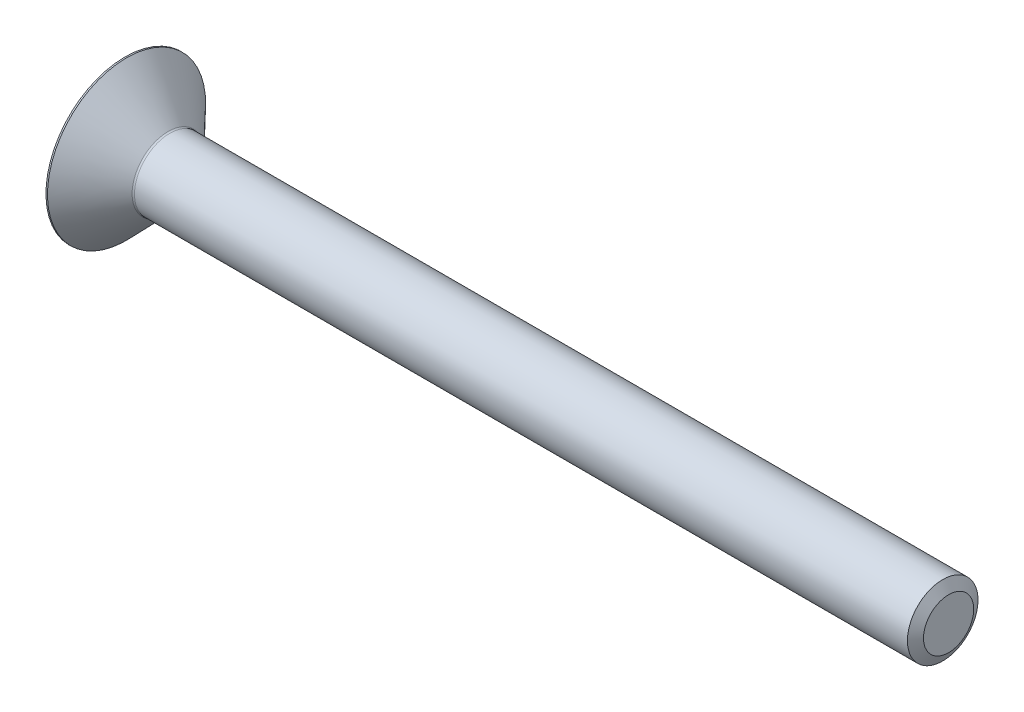
ISO-10303-21;
HEADER;
FILE_DESCRIPTION(('STEP AP214'),'2;1');
FILE_NAME('part.step','',(''),(''),'','','');
FILE_SCHEMA(('AUTOMOTIVE_DESIGN { 1 0 10303 214 1 1 1 1 }'));
ENDSEC;
DATA;
#1=APPLICATION_CONTEXT('core data for automotive mechanical design processes');
#2=APPLICATION_PROTOCOL_DEFINITION('international standard','automotive_design',2000,#1);
#3=PRODUCT_CONTEXT('',#1,'mechanical');
#4=PRODUCT('Part','Part','',(#3));
#5=PRODUCT_RELATED_PRODUCT_CATEGORY('part','',(#4));
#6=PRODUCT_DEFINITION_FORMATION('','',#4);
#7=PRODUCT_DEFINITION_CONTEXT('part definition',#1,'design');
#8=PRODUCT_DEFINITION('design','',#6,#7);
#9=PRODUCT_DEFINITION_SHAPE('','',#8);
#10=(LENGTH_UNIT() NAMED_UNIT(*) SI_UNIT(.MILLI.,.METRE.));
#11=(NAMED_UNIT(*) PLANE_ANGLE_UNIT() SI_UNIT($,.RADIAN.));
#12=(NAMED_UNIT(*) SI_UNIT($,.STERADIAN.) SOLID_ANGLE_UNIT());
#13=UNCERTAINTY_MEASURE_WITH_UNIT(LENGTH_MEASURE(1.E-05),#10,'distance_accuracy_value','');
#14=(GEOMETRIC_REPRESENTATION_CONTEXT(3) GLOBAL_UNCERTAINTY_ASSIGNED_CONTEXT((#13)) GLOBAL_UNIT_ASSIGNED_CONTEXT((#10,
#11,#12)) REPRESENTATION_CONTEXT('',''));
#15=CARTESIAN_POINT('',(0.,0.,0.));
#16=DIRECTION('',(0.,0.,1.));
#17=DIRECTION('',(1.,0.,0.));
#18=AXIS2_PLACEMENT_3D('',#15,#16,#17);
#19=CARTESIAN_POINT('',(0.,0.,0.));
#20=DIRECTION('',(1.,0.,0.));
#21=DIRECTION('',(0.,1.,0.));
#22=AXIS2_PLACEMENT_3D('',#19,#20,#21);
#23=CYLINDRICAL_SURFACE('',#22,1.5);
#24=CARTESIAN_POINT('',(-33.0975525183791,0.,0.));
#25=DIRECTION('',(1.,0.,0.));
#26=DIRECTION('',(0.,1.,0.));
#27=AXIS2_PLACEMENT_3D('',#24,#25,#26);
#28=CIRCLE('',#27,1.5);
#29=CARTESIAN_POINT('',(-33.0975525183791,1.5,0.));
#30=VERTEX_POINT('',#29);
#31=EDGE_CURVE('E102',#30,#30,#28,.T.);
#32=ORIENTED_EDGE('',*,*,#31,.T.);
#33=EDGE_LOOP('',(#32));
#34=FACE_BOUND('',#33,.T.);
#35=CARTESIAN_POINT('',(-0.25,0.,0.));
#36=DIRECTION('',(-1.,0.,0.));
#37=DIRECTION('',(0.,0.,1.));
#38=AXIS2_PLACEMENT_3D('',#35,#36,#37);
#39=CIRCLE('',#38,1.5);
#40=CARTESIAN_POINT('',(-0.25,0.,1.5));
#41=VERTEX_POINT('',#40);
#42=EDGE_CURVE('E92',#41,#41,#39,.T.);
#43=ORIENTED_EDGE('',*,*,#42,.T.);
#44=EDGE_LOOP('',(#43));
#45=FACE_BOUND('',#44,.T.);
#46=ADVANCED_FACE('F17',(#34,#45),#23,.T.);
#47=CARTESIAN_POINT('',(-35.,3.36,0.));
#48=DIRECTION('',(-1.,0.,0.));
#49=DIRECTION('',(0.,-1.,0.));
#50=AXIS2_PLACEMENT_3D('',#47,#48,#49);
#51=PLANE('',#50);
#52=CARTESIAN_POINT('',(-35.,0.,0.));
#53=DIRECTION('',(1.,0.,0.));
#54=DIRECTION('',(0.,1.,0.));
#55=AXIS2_PLACEMENT_3D('',#52,#53,#54);
#56=CIRCLE('',#55,3.36);
#57=CARTESIAN_POINT('',(-35.,3.36,0.));
#58=VERTEX_POINT('',#57);
#59=EDGE_CURVE('E198',#58,#58,#56,.T.);
#60=ORIENTED_EDGE('',*,*,#59,.F.);
#61=EDGE_LOOP('',(#60));
#62=FACE_BOUND('',#61,.T.);
#63=CARTESIAN_POINT('',(-35.,0.,0.));
#64=DIRECTION('',(-1.,0.,0.));
#65=DIRECTION('',(0.,-1.,0.));
#66=AXIS2_PLACEMENT_3D('',#63,#64,#65);
#67=CIRCLE('',#66,1.15470053837925);
#68=CARTESIAN_POINT('',(-35.,-0.577350269189638,0.999999999999989));
#69=VERTEX_POINT('',#68);
#70=CARTESIAN_POINT('',(-35.,-1.15470053837925,0.));
#71=VERTEX_POINT('',#70);
#72=EDGE_CURVE('E21',#69,#71,#67,.F.);
#73=ORIENTED_EDGE('',*,*,#72,.T.);
#74=CARTESIAN_POINT('',(-35.,-0.577350269189637,-0.999999999999989));
#75=VERTEX_POINT('',#74);
#76=EDGE_CURVE('E11',#71,#75,#67,.F.);
#77=ORIENTED_EDGE('',*,*,#76,.T.);
#78=CARTESIAN_POINT('',(-35.,0.577350269189622,-1.));
#79=VERTEX_POINT('',#78);
#80=EDGE_CURVE('E27',#75,#79,#67,.F.);
#81=ORIENTED_EDGE('',*,*,#80,.T.);
#82=CARTESIAN_POINT('',(-35.,1.15470053837925,0.));
#83=VERTEX_POINT('',#82);
#84=EDGE_CURVE('E93',#79,#83,#67,.F.);
#85=ORIENTED_EDGE('',*,*,#84,.T.);
#86=CARTESIAN_POINT('',(-35.,0.,0.));
#87=DIRECTION('',(-1.,0.,0.));
#88=DIRECTION('',(0.,0.,1.));
#89=AXIS2_PLACEMENT_3D('',#86,#87,#88);
#90=CIRCLE('',#89,1.15470053837925);
#91=CARTESIAN_POINT('',(-35.,0.577350269189626,1.));
#92=VERTEX_POINT('',#91);
#93=EDGE_CURVE('E76',#92,#83,#90,.T.);
#94=ORIENTED_EDGE('',*,*,#93,.F.);
#95=EDGE_CURVE('E83',#92,#69,#67,.F.);
#96=ORIENTED_EDGE('',*,*,#95,.T.);
#97=EDGE_LOOP('',(#73,#77,#81,#85,#94,#96));
#98=FACE_BOUND('',#97,.T.);
#99=ADVANCED_FACE('F95',(#62,#98),#51,.T.);
#100=CARTESIAN_POINT('',(0.,0.,0.));
#101=DIRECTION('',(1.,0.,0.));
#102=DIRECTION('',(0.,1.,0.));
#103=AXIS2_PLACEMENT_3D('',#100,#101,#102);
#104=CYLINDRICAL_SURFACE('',#103,3.36);
#105=ORIENTED_EDGE('',*,*,#59,.T.);
#106=EDGE_LOOP('',(#105));
#107=FACE_BOUND('',#106,.T.);
#108=CARTESIAN_POINT('',(-34.9361811211411,0.,0.));
#109=DIRECTION('',(1.,0.,0.));
#110=DIRECTION('',(0.,1.,0.));
#111=AXIS2_PLACEMENT_3D('',#108,#109,#110);
#112=CIRCLE('',#111,3.36);
#113=CARTESIAN_POINT('',(-34.9361811211411,3.36,0.));
#114=VERTEX_POINT('',#113);
#115=EDGE_CURVE('E196',#114,#114,#112,.T.);
#116=ORIENTED_EDGE('',*,*,#115,.F.);
#117=EDGE_LOOP('',(#116));
#118=FACE_BOUND('',#117,.T.);
#119=ADVANCED_FACE('F183',(#107,#118),#104,.T.);
#120=CARTESIAN_POINT('',(-33.1694864984129,0.,0.));
#121=DIRECTION('',(-1.,0.,0.));
#122=DIRECTION('',(0.,-1.,0.));
#123=AXIS2_PLACEMENT_3D('',#120,#121,#122);
#124=CONICAL_SURFACE('',#123,1.5305341629541,0.802851455917395);
#125=ORIENTED_EDGE('',*,*,#115,.T.);
#126=EDGE_LOOP('',(#125));
#127=FACE_BOUND('',#126,.T.);
#128=CARTESIAN_POINT('',(-33.1694864984129,0.,0.));
#129=DIRECTION('',(1.,0.,0.));
#130=DIRECTION('',(0.,1.,0.));
#131=AXIS2_PLACEMENT_3D('',#128,#129,#130);
#132=CIRCLE('',#131,1.5305341629541);
#133=CARTESIAN_POINT('',(-33.1694864984129,1.5305341629541,0.));
#134=VERTEX_POINT('',#133);
#135=EDGE_CURVE('E205',#134,#134,#132,.T.);
#136=ORIENTED_EDGE('',*,*,#135,.F.);
#137=EDGE_LOOP('',(#136));
#138=FACE_BOUND('',#137,.T.);
#139=ADVANCED_FACE('F177',(#127,#138),#124,.T.);
#140=CARTESIAN_POINT('',(-33.0975525183791,0.,0.));
#141=DIRECTION('',(1.,0.,0.));
#142=DIRECTION('',(0.,1.,0.));
#143=AXIS2_PLACEMENT_3D('',#140,#141,#142);
#144=TOROIDAL_SURFACE('',#143,1.6,0.0999999999999989);
#145=ORIENTED_EDGE('',*,*,#135,.T.);
#146=EDGE_LOOP('',(#145));
#147=FACE_BOUND('',#146,.T.);
#148=ORIENTED_EDGE('',*,*,#31,.F.);
#149=EDGE_LOOP('',(#148));
#150=FACE_BOUND('',#149,.T.);
#151=ADVANCED_FACE('F175',(#147,#150),#144,.F.);
#152=CARTESIAN_POINT('',(-34.67,0.,0.));
#153=DIRECTION('',(-1.,0.,0.));
#154=DIRECTION('',(0.,0.,1.));
#155=AXIS2_PLACEMENT_3D('',#152,#153,#154);
#156=CONICAL_SURFACE('',#155,0.,1.2924281638629);
#157=CARTESIAN_POINT('',(-35.0000330049495,-0.577234799135792,1.0002));
#158=CARTESIAN_POINT('',(-34.9931767723132,-0.601209328784407,0.958674896561033));
#159=CARTESIAN_POINT('',(-34.986950249306,-0.62523320973396,0.917064314161422));
#160=CARTESIAN_POINT('',(-34.9760082019855,-0.673377505205151,0.833675948310711));
#161=CARTESIAN_POINT('',(-34.9712933817242,-0.697497959424802,0.791898096100637));
#162=CARTESIAN_POINT('',(-34.9636556441477,-0.745669161891499,0.70846312596663));
#163=CARTESIAN_POINT('',(-34.9607223745609,-0.769719488656237,0.666806738071471));
#164=CARTESIAN_POINT('',(-34.9567889588686,-0.817855017501821,0.583433556461721));
#165=CARTESIAN_POINT('',(-34.9557883832489,-0.841940210643132,0.541716778230861));
#166=CARTESIAN_POINT('',(-34.9557883832489,-0.890110596925755,0.45828322176914));
#167=CARTESIAN_POINT('',(-34.9567889588686,-0.914195790067066,0.41656644353828));
#168=CARTESIAN_POINT('',(-34.9607223745609,-0.96233131891265,0.33319326192853));
#169=CARTESIAN_POINT('',(-34.9636556441477,-0.986381645677388,0.29153687403337));
#170=CARTESIAN_POINT('',(-34.9712933817242,-1.03455284814408,0.208101903899364));
#171=CARTESIAN_POINT('',(-34.9760082019855,-1.05867330236374,0.16632405168929));
#172=CARTESIAN_POINT('',(-34.986950249306,-1.10681759783493,0.0829356858385795));
#173=CARTESIAN_POINT('',(-34.9931767723132,-1.13084147878448,0.0413251034389682));
#174=CARTESIAN_POINT('',(-35.0000330049495,-1.15481600843309,-0.000199999999999413));
#175=B_SPLINE_CURVE_WITH_KNOTS('',3,(#157,#158,#159,#160,#161,#162,#163,#164,#165,#166,#167,
#168,#169,#170,#171,#172,#173,#174),.UNSPECIFIED.,.F.,.F.,(4,2,2,2,2,2,2,2,4),(0.,
0.145319064827825,0.290705711767534,0.435239252261502,0.579740668498363,0.724242084735224,
0.868775625229192,1.0141622721689,1.15948133699673),.UNSPECIFIED.);
#176=EDGE_CURVE('E109',#69,#71,#175,.T.);
#177=ORIENTED_EDGE('',*,*,#176,.T.);
#178=ORIENTED_EDGE('',*,*,#72,.F.);
#179=EDGE_LOOP('',(#177,#178));
#180=FACE_BOUND('',#179,.T.);
#181=ADVANCED_FACE('F178',(#180),#156,.F.);
#182=CARTESIAN_POINT('',(-35.1864201247989,-1.50507658562173,1.));
#183=CARTESIAN_POINT('',(-35.1756805338984,-1.4599519168315,1.));
#184=CARTESIAN_POINT('',(-35.1650772555009,-1.41479478404146,1.));
#185=CARTESIAN_POINT('',(-35.1442124650908,-1.32439927872502,1.));
#186=CARTESIAN_POINT('',(-35.1339509706694,-1.27916090214298,1.));
#187=CARTESIAN_POINT('',(-35.1037611048582,-1.14320091952672,1.));
#188=CARTESIAN_POINT('',(-35.0844526928259,-1.0523395057026,1.));
#189=CARTESIAN_POINT('',(-35.0485427680109,-0.871021733651421,1.));
#190=CARTESIAN_POINT('',(-35.0319160072656,-0.780570478060278,1.));
#191=CARTESIAN_POINT('',(-35.0024593897724,-0.59905383403234,1.));
#192=CARTESIAN_POINT('',(-34.9896286440471,-0.507988594500087,1.));
#193=CARTESIAN_POINT('',(-34.9694337517461,-0.324017010133662,1.));
#194=CARTESIAN_POINT('',(-34.9621421851974,-0.231102062710147,1.));
#195=CARTESIAN_POINT('',(-34.9566778251239,-0.0915430747170676,1.));
#196=CARTESIAN_POINT('',(-34.9557682159605,-0.045000514493487,1.));
#197=CARTESIAN_POINT('',(-34.9558092297991,0.0480838901527561,1.));
#198=CARTESIAN_POINT('',(-34.9567598571057,0.0946257345735132,1.));
#199=CARTESIAN_POINT('',(-34.9623591123097,0.234573783926043,1.));
#200=CARTESIAN_POINT('',(-34.9697714997025,0.327875024932953,1.));
#201=CARTESIAN_POINT('',(-34.9903648179936,0.513866327853419,1.));
#202=CARTESIAN_POINT('',(-35.0035505473147,0.606555816131257,1.));
#203=CARTESIAN_POINT('',(-35.0343302733835,0.794559797027585,1.));
#204=CARTESIAN_POINT('',(-35.0520641733632,0.889850634542129,1.));
#205=CARTESIAN_POINT('',(-35.0901792888416,1.07990716554414,1.));
#206=CARTESIAN_POINT('',(-35.1105609899614,1.17467275936657,1.));
#207=CARTESIAN_POINT('',(-35.1530302070275,1.36384761434309,1.));
#208=CARTESIAN_POINT('',(-35.1751182493127,1.45825675605086,1.));
#209=CARTESIAN_POINT('',(-35.2204204884301,1.64680497415502,1.));
#210=CARTESIAN_POINT('',(-35.2436347126392,1.74094404392715,1.));
#211=CARTESIAN_POINT('',(-35.2904980732842,1.92768913293955,1.));
#212=CARTESIAN_POINT('',(-35.314136313184,2.02029789764915,1.));
#213=CARTESIAN_POINT('',(-35.3619465911489,2.20537976707469,1.));
#214=CARTESIAN_POINT('',(-35.3861186431024,2.29785286819408,1.));
#215=CARTESIAN_POINT('',(-35.4348136295748,2.48255351818144,1.));
#216=CARTESIAN_POINT('',(-35.4593359637595,2.57478122564269,1.));
#217=CARTESIAN_POINT('',(-35.5086763218414,2.75915354563857,1.));
#218=CARTESIAN_POINT('',(-35.5334943336761,2.85129816139918,1.));
#219=CARTESIAN_POINT('',(-35.5584153528749,2.94341459729472,1.));
#220=B_SPLINE_CURVE_WITH_KNOTS('',3,(#182,#183,#184,#185,#186,#187,#188,#189,#190,#191,#192,
#193,#194,#195,#196,#197,#198,#199,#200,#201,#202,#203,#204,#205,#206,#207,#208,#209,#210,#211,
#212,#213,#214,#215,#216,#217,#218,#219),.UNSPECIFIED.,.F.,.F.,(4,2,2,2,2,2,2,2,2,2,2,2,2,2,2,2,
2,2,4),(0.,0.139154753232826,0.278316657587889,0.55696460448011,0.832812881766304,
1.10859650773443,1.38793420964472,1.52755398880044,1.6671740910407,1.94769382621525,
2.22844715485886,2.51916941430298,2.80994506926725,3.10081077796328,3.3916835609739,
3.67841536084615,3.96515462957437,4.25145053495917,4.53773480030586),.UNSPECIFIED.);
#221=EDGE_CURVE('E82',#92,#69,#220,.F.);
#222=ORIENTED_EDGE('',*,*,#221,.T.);
#223=ORIENTED_EDGE('',*,*,#95,.F.);
#224=EDGE_LOOP('',(#222,#223));
#225=FACE_BOUND('',#224,.T.);
#226=ADVANCED_FACE('F88',(#225),#156,.F.);
#227=CARTESIAN_POINT('',(-35.0000330049495,1.15481600843308,-0.000199999999999521));
#228=CARTESIAN_POINT('',(-34.9931767723132,1.13084147878447,0.0413251034389683));
#229=CARTESIAN_POINT('',(-34.986950249306,1.10681759783492,0.0829356858385801));
#230=CARTESIAN_POINT('',(-34.9760082019855,1.05867330236373,0.166324051689291));
#231=CARTESIAN_POINT('',(-34.9712933817242,1.03455284814408,0.208101903899364));
#232=CARTESIAN_POINT('',(-34.9636556441477,0.986381645677379,0.29153687403337));
#233=CARTESIAN_POINT('',(-34.9607223745609,0.962331318912641,0.33319326192853));
#234=CARTESIAN_POINT('',(-34.9567889588686,0.914195790067057,0.41656644353828));
#235=CARTESIAN_POINT('',(-34.9557883832489,0.890110596925745,0.45828322176914));
#236=CARTESIAN_POINT('',(-34.9557883832489,0.841940210643123,0.541716778230861));
#237=CARTESIAN_POINT('',(-34.9567889588686,0.817855017501812,0.583433556461721));
#238=CARTESIAN_POINT('',(-34.9607223745609,0.769719488656228,0.666806738071471));
#239=CARTESIAN_POINT('',(-34.9636556441477,0.74566916189149,0.708463125966631));
#240=CARTESIAN_POINT('',(-34.9712933817242,0.697497959424793,0.791898096100637));
#241=CARTESIAN_POINT('',(-34.9760082019855,0.673377505205142,0.83367594831071));
#242=CARTESIAN_POINT('',(-34.986950249306,0.625233209733952,0.917064314161421));
#243=CARTESIAN_POINT('',(-34.9931767723132,0.601209328784399,0.958674896561032));
#244=CARTESIAN_POINT('',(-35.0000330049495,0.577234799135784,1.0002));
#245=B_SPLINE_CURVE_WITH_KNOTS('',3,(#227,#228,#229,#230,#231,#232,#233,#234,#235,#236,#237,
#238,#239,#240,#241,#242,#243,#244),.UNSPECIFIED.,.F.,.F.,(4,2,2,2,2,2,2,2,4),(0.,
0.145319064827825,0.290705711767534,0.435239252261502,0.579740668498363,0.724242084735225,
0.868775625229192,1.0141622721689,1.15948133699673),.UNSPECIFIED.);
#246=EDGE_CURVE('E71',#83,#92,#245,.T.);
#247=ORIENTED_EDGE('',*,*,#246,.T.);
#248=ORIENTED_EDGE('',*,*,#93,.T.);
#249=EDGE_LOOP('',(#247,#248));
#250=FACE_BOUND('',#249,.T.);
#251=ADVANCED_FACE('F72',(#250),#156,.F.);
#252=CARTESIAN_POINT('',(-35.0000330049495,0.577234799135784,-1.0002));
#253=CARTESIAN_POINT('',(-34.9931767723132,0.601209328784399,-0.958674896561032));
#254=CARTESIAN_POINT('',(-34.986950249306,0.625233209733952,-0.917064314161421));
#255=CARTESIAN_POINT('',(-34.9760082019855,0.673377505205143,-0.83367594831071));
#256=CARTESIAN_POINT('',(-34.9712933817242,0.697497959424793,-0.791898096100636));
#257=CARTESIAN_POINT('',(-34.9636556441477,0.74566916189149,-0.70846312596663));
#258=CARTESIAN_POINT('',(-34.9607223745609,0.769719488656228,-0.666806738071471));
#259=CARTESIAN_POINT('',(-34.9567889588686,0.817855017501813,-0.583433556461721));
#260=CARTESIAN_POINT('',(-34.9557883832489,0.841940210643124,-0.541716778230861));
#261=CARTESIAN_POINT('',(-34.9557883832489,0.890110596925746,-0.45828322176914));
#262=CARTESIAN_POINT('',(-34.9567889588686,0.914195790067057,-0.416566443538279));
#263=CARTESIAN_POINT('',(-34.9607223745609,0.962331318912642,-0.33319326192853));
#264=CARTESIAN_POINT('',(-34.9636556441477,0.98638164567738,-0.29153687403337));
#265=CARTESIAN_POINT('',(-34.9712933817242,1.03455284814408,-0.208101903899364));
#266=CARTESIAN_POINT('',(-34.9760082019855,1.05867330236373,-0.16632405168929));
#267=CARTESIAN_POINT('',(-34.986950249306,1.10681759783492,-0.0829356858385797));
#268=CARTESIAN_POINT('',(-34.9931767723132,1.13084147878447,-0.0413251034389678));
#269=CARTESIAN_POINT('',(-35.0000330049495,1.15481600843308,0.000200000000000572));
#270=B_SPLINE_CURVE_WITH_KNOTS('',3,(#252,#253,#254,#255,#256,#257,#258,#259,#260,#261,#262,
#263,#264,#265,#266,#267,#268,#269),.UNSPECIFIED.,.F.,.F.,(4,2,2,2,2,2,2,2,4),(0.,
0.145319064827826,0.290705711767534,0.435239252261502,0.579740668498363,0.724242084735225,
0.868775625229192,1.0141622721689,1.15948133699673),.UNSPECIFIED.);
#271=EDGE_CURVE('E94',#79,#83,#270,.T.);
#272=ORIENTED_EDGE('',*,*,#271,.T.);
#273=ORIENTED_EDGE('',*,*,#84,.F.);
#274=EDGE_LOOP('',(#272,#273));
#275=FACE_BOUND('',#274,.T.);
#276=ADVANCED_FACE('F276',(#275),#156,.F.);
#277=CARTESIAN_POINT('',(-35.1864201247989,-1.50507658562173,-1.));
#278=CARTESIAN_POINT('',(-35.1756805338984,-1.4599519168315,-1.));
#279=CARTESIAN_POINT('',(-35.1650772555009,-1.41479478404146,-1.));
#280=CARTESIAN_POINT('',(-35.1442124650908,-1.32439927872502,-1.));
#281=CARTESIAN_POINT('',(-35.1339509706694,-1.27916090214298,-1.));
#282=CARTESIAN_POINT('',(-35.1037611048582,-1.14320091952672,-1.));
#283=CARTESIAN_POINT('',(-35.0844526928259,-1.0523395057026,-1.));
#284=CARTESIAN_POINT('',(-35.0485427680109,-0.871021733651421,-1.));
#285=CARTESIAN_POINT('',(-35.0319160072656,-0.780570478060278,-1.));
#286=CARTESIAN_POINT('',(-35.0024593897724,-0.59905383403234,-1.));
#287=CARTESIAN_POINT('',(-34.9896286440471,-0.507988594500087,-1.));
#288=CARTESIAN_POINT('',(-34.9694337517461,-0.324017010133662,-1.));
#289=CARTESIAN_POINT('',(-34.9621421851974,-0.231102062710147,-1.));
#290=CARTESIAN_POINT('',(-34.9566778251239,-0.0915430747170676,-1.));
#291=CARTESIAN_POINT('',(-34.9557682159605,-0.045000514493487,-1.));
#292=CARTESIAN_POINT('',(-34.9558092297991,0.0480838901527561,-1.));
#293=CARTESIAN_POINT('',(-34.9567598571057,0.0946257345735132,-1.));
#294=CARTESIAN_POINT('',(-34.9623591123097,0.234573783926043,-1.));
#295=CARTESIAN_POINT('',(-34.9697714997025,0.327875024932953,-1.));
#296=CARTESIAN_POINT('',(-34.9903648179936,0.513866327853419,-1.));
#297=CARTESIAN_POINT('',(-35.0035505473147,0.606555816131257,-1.));
#298=CARTESIAN_POINT('',(-35.0343302733835,0.794559797027585,-1.));
#299=CARTESIAN_POINT('',(-35.0520641733632,0.889850634542129,-1.));
#300=CARTESIAN_POINT('',(-35.0901792888416,1.07990716554414,-1.));
#301=CARTESIAN_POINT('',(-35.1105609899614,1.17467275936657,-1.));
#302=CARTESIAN_POINT('',(-35.1530302070275,1.36384761434309,-1.));
#303=CARTESIAN_POINT('',(-35.1751182493127,1.45825675605086,-1.));
#304=CARTESIAN_POINT('',(-35.2204204884301,1.64680497415502,-1.));
#305=CARTESIAN_POINT('',(-35.2436347126392,1.74094404392715,-1.));
#306=CARTESIAN_POINT('',(-35.2904980732842,1.92768913293955,-1.));
#307=CARTESIAN_POINT('',(-35.314136313184,2.02029789764915,-1.));
#308=CARTESIAN_POINT('',(-35.3619465911489,2.20537976707469,-1.));
#309=CARTESIAN_POINT('',(-35.3861186431024,2.29785286819408,-1.));
#310=CARTESIAN_POINT('',(-35.4348136295748,2.48255351818144,-1.));
#311=CARTESIAN_POINT('',(-35.4593359637595,2.57478122564269,-1.));
#312=CARTESIAN_POINT('',(-35.5086763218414,2.75915354563857,-1.));
#313=CARTESIAN_POINT('',(-35.5334943336761,2.85129816139918,-1.));
#314=CARTESIAN_POINT('',(-35.5584153528749,2.94341459729472,-1.));
#315=B_SPLINE_CURVE_WITH_KNOTS('',3,(#277,#278,#279,#280,#281,#282,#283,#284,#285,#286,#287,
#288,#289,#290,#291,#292,#293,#294,#295,#296,#297,#298,#299,#300,#301,#302,#303,#304,#305,#306,
#307,#308,#309,#310,#311,#312,#313,#314),.UNSPECIFIED.,.F.,.F.,(4,2,2,2,2,2,2,2,2,2,2,2,2,2,2,2,
2,2,4),(0.,0.139154753232826,0.278316657587889,0.55696460448011,0.832812881766304,
1.10859650773443,1.38793420964472,1.52755398880044,1.6671740910407,1.94769382621525,
2.22844715485886,2.51916941430298,2.80994506926725,3.10081077796328,3.3916835609739,
3.67841536084615,3.96515462957437,4.25145053495917,4.53773480030586),.UNSPECIFIED.);
#316=EDGE_CURVE('E235',#75,#79,#315,.T.);
#317=ORIENTED_EDGE('',*,*,#316,.T.);
#318=ORIENTED_EDGE('',*,*,#80,.F.);
#319=EDGE_LOOP('',(#317,#318));
#320=FACE_BOUND('',#319,.T.);
#321=ADVANCED_FACE('F262',(#320),#156,.F.);
#322=CARTESIAN_POINT('',(-35.0000330049495,-1.15481600843309,0.000200000000000122));
#323=CARTESIAN_POINT('',(-34.9931767723132,-1.13084147878448,-0.0413251034389676));
#324=CARTESIAN_POINT('',(-34.986950249306,-1.10681759783493,-0.0829356858385791));
#325=CARTESIAN_POINT('',(-34.9760082019855,-1.05867330236374,-0.16632405168929));
#326=CARTESIAN_POINT('',(-34.9712933817242,-1.03455284814409,-0.208101903899364));
#327=CARTESIAN_POINT('',(-34.9636556441477,-0.986381645677388,-0.29153687403337));
#328=CARTESIAN_POINT('',(-34.9607223745609,-0.96233131891265,-0.33319326192853));
#329=CARTESIAN_POINT('',(-34.9567889588686,-0.914195790067066,-0.416566443538279));
#330=CARTESIAN_POINT('',(-34.9557883832489,-0.890110596925755,-0.45828322176914));
#331=CARTESIAN_POINT('',(-34.9557883832489,-0.841940210643132,-0.54171677823086));
#332=CARTESIAN_POINT('',(-34.9567889588686,-0.817855017501821,-0.583433556461721));
#333=CARTESIAN_POINT('',(-34.9607223745609,-0.769719488656237,-0.66680673807147));
#334=CARTESIAN_POINT('',(-34.9636556441477,-0.745669161891499,-0.70846312596663));
#335=CARTESIAN_POINT('',(-34.9712933817242,-0.697497959424802,-0.791898096100636));
#336=CARTESIAN_POINT('',(-34.9760082019855,-0.673377505205151,-0.833675948310711));
#337=CARTESIAN_POINT('',(-34.986950249306,-0.62523320973396,-0.917064314161421));
#338=CARTESIAN_POINT('',(-34.9931767723132,-0.601209328784407,-0.958674896561033));
#339=CARTESIAN_POINT('',(-35.0000330049495,-0.577234799135792,-1.0002));
#340=B_SPLINE_CURVE_WITH_KNOTS('',3,(#322,#323,#324,#325,#326,#327,#328,#329,#330,#331,#332,
#333,#334,#335,#336,#337,#338,#339),.UNSPECIFIED.,.F.,.F.,(4,2,2,2,2,2,2,2,4),(0.,
0.145319064827824,0.290705711767534,0.435239252261502,0.579740668498363,0.724242084735224,
0.868775625229193,1.0141622721689,1.15948133699673),.UNSPECIFIED.);
#341=EDGE_CURVE('E115',#71,#75,#340,.T.);
#342=ORIENTED_EDGE('',*,*,#341,.T.);
#343=ORIENTED_EDGE('',*,*,#76,.F.);
#344=EDGE_LOOP('',(#342,#343));
#345=FACE_BOUND('',#344,.T.);
#346=ADVANCED_FACE('F270',(#345),#156,.F.);
#347=CARTESIAN_POINT('',(-33.9,0.,0.));
#348=DIRECTION('',(-1.,0.,0.));
#349=DIRECTION('',(0.,0.,1.));
#350=AXIS2_PLACEMENT_3D('',#347,#348,#349);
#351=CONICAL_SURFACE('',#350,1.15470053837925,1.0471975511966);
#352=CARTESIAN_POINT('',(-33.2333333333333,0.,0.));
#353=VERTEX_POINT('',#352);
#354=VERTEX_LOOP('',#353);
#355=FACE_BOUND('',#354,.T.);
#356=CARTESIAN_POINT('',(-34.2718352887395,-1.49514512143373,1.));
#357=CARTESIAN_POINT('',(-34.2511150207935,-1.4519612611533,1.));
#358=CARTESIAN_POINT('',(-34.2306136723495,-1.40867282404236,1.));
#359=CARTESIAN_POINT('',(-34.1901634335246,-1.32182947914248,1.));
#360=CARTESIAN_POINT('',(-34.1702146425673,-1.27827452509756,1.));
#361=CARTESIAN_POINT('',(-34.1111451548365,-1.14662339890625,1.));
#362=CARTESIAN_POINT('',(-34.073052526533,-1.05805724149108,1.));
#363=CARTESIAN_POINT('',(-34.0002458207006,-0.87683300317249,1.));
#364=CARTESIAN_POINT('',(-33.9656458404539,-0.784128452056489,1.));
#365=CARTESIAN_POINT('',(-33.9040734738184,-0.596331746532128,1.));
#366=CARTESIAN_POINT('',(-33.8770812848478,-0.501246505541258,1.));
#367=CARTESIAN_POINT('',(-33.845775770035,-0.356699986452703,1.));
#368=CARTESIAN_POINT('',(-33.836875098547,-0.308244163171707,1.));
#369=CARTESIAN_POINT('',(-33.8227424317569,-0.210788870695441,1.));
#370=CARTESIAN_POINT('',(-33.8175101885352,-0.161789438465742,1.));
#371=CARTESIAN_POINT('',(-33.8111989809818,-0.0641060489970671,1.));
#372=CARTESIAN_POINT('',(-33.8100710050111,-0.0154253461269774,1.));
#373=CARTESIAN_POINT('',(-33.8119329783052,0.0818553564032749,1.));
#374=CARTESIAN_POINT('',(-33.8149231825536,0.130455350879701,1.));
#375=CARTESIAN_POINT('',(-33.8271183217293,0.250369589613777,1.));
#376=CARTESIAN_POINT('',(-33.8386085609849,0.321451919115029,1.));
#377=CARTESIAN_POINT('',(-33.8682403173976,0.462229038490169,1.));
#378=CARTESIAN_POINT('',(-33.8863898509449,0.531922048861731,1.));
#379=CARTESIAN_POINT('',(-33.9278697226866,0.671415729806803,1.));
#380=CARTESIAN_POINT('',(-33.9513071683069,0.741183729418068,1.));
#381=CARTESIAN_POINT('',(-34.0015644882464,0.87943831939628,1.));
#382=CARTESIAN_POINT('',(-34.0283831752305,0.947925349932546,1.));
#383=CARTESIAN_POINT('',(-34.1000539154734,1.12214515906642,1.));
#384=CARTESIAN_POINT('',(-34.146572305199,1.22718574040676,1.));
#385=CARTESIAN_POINT('',(-34.242876922248,1.43575968104557,1.));
#386=CARTESIAN_POINT('',(-34.2926639878222,1.53929264533346,1.));
#387=CARTESIAN_POINT('',(-34.3943364445346,1.7454670233882,1.));
#388=CARTESIAN_POINT('',(-34.446224181867,1.84810727553996,1.));
#389=CARTESIAN_POINT('',(-34.5513383688352,2.05270058021723,1.));
#390=CARTESIAN_POINT('',(-34.6045648626723,2.1546536099117,1.));
#391=CARTESIAN_POINT('',(-34.7068669169112,2.3484655309128,1.));
#392=CARTESIAN_POINT('',(-34.755859658964,2.44036823161568,1.));
#393=CARTESIAN_POINT('',(-34.8544031328282,2.62387799005298,1.));
#394=CARTESIAN_POINT('',(-34.9039538852895,2.71548503668385,1.));
#395=CARTESIAN_POINT('',(-35.0033471076798,2.89823865557591,1.));
#396=CARTESIAN_POINT('',(-35.053188515041,2.98938580641154,1.));
#397=CARTESIAN_POINT('',(-35.1531957233761,3.17149583112621,1.));
#398=CARTESIAN_POINT('',(-35.2033615072372,3.26245871439933,1.));
#399=CARTESIAN_POINT('',(-35.253646212205,3.35335539208173,1.));
#400=B_SPLINE_CURVE_WITH_KNOTS('',3,(#356,#357,#358,#359,#360,#361,#362,#363,#364,#365,#366,
#367,#368,#369,#370,#371,#372,#373,#374,#375,#376,#377,#378,#379,#380,#381,#382,#383,#384,#385,
#386,#387,#388,#389,#390,#391,#392,#393,#394,#395,#396,#397,#398,#399),.UNSPECIFIED.,.F.,.F.,(4,
2,2,2,2,2,2,2,2,2,2,2,2,2,2,2,2,2,2,2,2,4),(0.,0.143690341820651,0.287406372566277,
0.576560332877506,0.873259488934041,1.16917907000007,1.31686338831958,1.46453772487643,
1.61044269221659,1.75635669390452,1.97192533331898,2.18775432802314,2.40842600301165,
2.62902040304935,2.97355048126457,3.31816926186282,3.66318417395129,4.00821049225239,
4.32064609598594,4.63309330006987,4.9447457824876,5.25638195528641),.UNSPECIFIED.);
#401=CARTESIAN_POINT('',(-33.9,-0.57735026918963,1.));
#402=VERTEX_POINT('',#401);
#403=CARTESIAN_POINT('',(-33.9,0.577350269189622,1.));
#404=VERTEX_POINT('',#403);
#405=EDGE_CURVE('E145',#402,#404,#400,.T.);
#406=ORIENTED_EDGE('',*,*,#405,.T.);
#407=CARTESIAN_POINT('',(-33.9000666766657,0.577234799135784,1.0002));
#408=CARTESIAN_POINT('',(-33.8854089736492,0.602607795820542,0.956252680601723));
#409=CARTESIAN_POINT('',(-33.8720777236209,0.628199807531652,0.911926016050183));
#410=CARTESIAN_POINT('',(-33.8488065076235,0.679827098330825,0.822504925328881));
#411=CARTESIAN_POINT('',(-33.8388747765498,0.705863295614152,0.777408908798272));
#412=CARTESIAN_POINT('',(-33.8234126948821,0.757612978088361,0.687775829477385));
#413=CARTESIAN_POINT('',(-33.8177794680989,0.783318495222177,0.643252567766784));
#414=CARTESIAN_POINT('',(-33.8110512886403,0.834850648373665,0.553996260284986));
#415=CARTESIAN_POINT('',(-33.8099507679217,0.860677096749775,0.509263539518507));
#416=CARTESIAN_POINT('',(-33.8122250522982,0.908946264126686,0.425658889182652));
#417=CARTESIAN_POINT('',(-33.8150414388634,0.931396163287554,0.386774523211231));
#418=CARTESIAN_POINT('',(-33.8239724502173,0.976149681982091,0.309259155014809));
#419=CARTESIAN_POINT('',(-33.8300901337543,0.998453146411449,0.270628421438356));
#420=CARTESIAN_POINT('',(-33.8453857257258,1.04329913914046,0.19295288351585));
#421=CARTESIAN_POINT('',(-33.854628552169,1.0658359836813,0.153917923728827));
#422=CARTESIAN_POINT('',(-33.8756068457555,1.11057330008463,0.0764306187239827));
#423=CARTESIAN_POINT('',(-33.8873373751337,1.13277434629517,0.0379772787061366));
#424=CARTESIAN_POINT('',(-33.9000666766657,1.15481600843309,-0.000200000000000207));
#425=B_SPLINE_CURVE_WITH_KNOTS('',3,(#407,#408,#409,#410,#411,#412,#413,#414,#415,#416,#417,
#418,#419,#420,#421,#422,#423,#424),.UNSPECIFIED.,.F.,.F.,(4,2,2,2,2,2,2,2,4),(0.,
0.158523820030122,0.317428970089347,0.472400167924638,0.627180939971656,0.762016584872722,
0.896977373984244,1.03493410168668,1.17261952416174),.UNSPECIFIED.);
#426=CARTESIAN_POINT('',(-33.9,1.15470053837925,0.));
#427=VERTEX_POINT('',#426);
#428=EDGE_CURVE('E101',#404,#427,#425,.T.);
#429=ORIENTED_EDGE('',*,*,#428,.T.);
#430=CARTESIAN_POINT('',(-33.9000666766657,1.15481600843309,0.000200000000000545));
#431=CARTESIAN_POINT('',(-33.8854089736492,1.12944301174833,-0.0437473193982767));
#432=CARTESIAN_POINT('',(-33.8720777236209,1.10385100003722,-0.088073983949817));
#433=CARTESIAN_POINT('',(-33.8488065076235,1.05222370923804,-0.177495074671119));
#434=CARTESIAN_POINT('',(-33.8388747765498,1.02618751195472,-0.222591091201728));
#435=CARTESIAN_POINT('',(-33.8234126948821,0.974437829480508,-0.312224170522616));
#436=CARTESIAN_POINT('',(-33.8177794680989,0.948732312346693,-0.356747432233217));
#437=CARTESIAN_POINT('',(-33.8110512886403,0.897200159195204,-0.446003739715015));
#438=CARTESIAN_POINT('',(-33.8099507679217,0.871373710819093,-0.490736460481494));
#439=CARTESIAN_POINT('',(-33.8122250522982,0.823104543442182,-0.574341110817349));
#440=CARTESIAN_POINT('',(-33.8150414388634,0.800654644281315,-0.61322547678877));
#441=CARTESIAN_POINT('',(-33.8239724502173,0.755901125586778,-0.690740844985192));
#442=CARTESIAN_POINT('',(-33.8300901337543,0.73359766115742,-0.729371578561644));
#443=CARTESIAN_POINT('',(-33.8453857257258,0.688751668428413,-0.80704711648415));
#444=CARTESIAN_POINT('',(-33.854628552169,0.666214823887569,-0.846082076271173));
#445=CARTESIAN_POINT('',(-33.8756068457555,0.621477507484243,-0.923569381276017));
#446=CARTESIAN_POINT('',(-33.8873373751337,0.5992764612737,-0.962022721293863));
#447=CARTESIAN_POINT('',(-33.9000666766657,0.577234799135784,-1.0002));
#448=B_SPLINE_CURVE_WITH_KNOTS('',3,(#430,#431,#432,#433,#434,#435,#436,#437,#438,#439,#440,
#441,#442,#443,#444,#445,#446,#447),.UNSPECIFIED.,.F.,.F.,(4,2,2,2,2,2,2,2,4),(0.,
0.158523820030122,0.317428970089348,0.472400167924639,0.627180939971658,0.762016584872724,
0.896977373984245,1.03493410168668,1.17261952416174),.UNSPECIFIED.);
#449=CARTESIAN_POINT('',(-33.9,0.577350269189624,-1.));
#450=VERTEX_POINT('',#449);
#451=EDGE_CURVE('E197',#427,#450,#448,.T.);
#452=ORIENTED_EDGE('',*,*,#451,.T.);
#453=CARTESIAN_POINT('',(-34.2718352887395,-1.49514512143372,-1.));
#454=CARTESIAN_POINT('',(-34.2511150207935,-1.45196126115329,-1.));
#455=CARTESIAN_POINT('',(-34.2306136723495,-1.40867282404236,-1.));
#456=CARTESIAN_POINT('',(-34.1901634335246,-1.32182947914248,-1.));
#457=CARTESIAN_POINT('',(-34.1702146425673,-1.27827452509756,-1.));
#458=CARTESIAN_POINT('',(-34.1111451548365,-1.14662339890625,-1.));
#459=CARTESIAN_POINT('',(-34.073052526533,-1.05805724149108,-1.));
#460=CARTESIAN_POINT('',(-34.0002458207006,-0.87683300317249,-1.));
#461=CARTESIAN_POINT('',(-33.9656458404539,-0.78412845205649,-1.));
#462=CARTESIAN_POINT('',(-33.9040734738184,-0.596331746532131,-1.));
#463=CARTESIAN_POINT('',(-33.8770812848478,-0.501246505541261,-1.));
#464=CARTESIAN_POINT('',(-33.845775770035,-0.356699986452707,-1.));
#465=CARTESIAN_POINT('',(-33.836875098547,-0.308244163171711,-1.));
#466=CARTESIAN_POINT('',(-33.8227424317569,-0.210788870695444,-1.));
#467=CARTESIAN_POINT('',(-33.8175101885352,-0.161789438465745,-1.));
#468=CARTESIAN_POINT('',(-33.8111989809818,-0.0641060489970689,-1.));
#469=CARTESIAN_POINT('',(-33.8100710050111,-0.0154253461269788,-1.));
#470=CARTESIAN_POINT('',(-33.8119329783052,0.0818553564032744,-1.));
#471=CARTESIAN_POINT('',(-33.8149231825536,0.130455350879701,-1.));
#472=CARTESIAN_POINT('',(-33.8271183217293,0.250369589613778,-1.));
#473=CARTESIAN_POINT('',(-33.8386085609849,0.321451919115029,-1.));
#474=CARTESIAN_POINT('',(-33.8682403173976,0.46222903849017,-1.));
#475=CARTESIAN_POINT('',(-33.8863898509449,0.531922048861733,-1.));
#476=CARTESIAN_POINT('',(-33.9278697226867,0.671415729806804,-1.));
#477=CARTESIAN_POINT('',(-33.9513071683069,0.741183729418068,-1.));
#478=CARTESIAN_POINT('',(-34.0015644882464,0.879438319396281,-1.));
#479=CARTESIAN_POINT('',(-34.0283831752305,0.947925349932547,-1.));
#480=CARTESIAN_POINT('',(-34.1000539154734,1.12214515906643,-1.));
#481=CARTESIAN_POINT('',(-34.146572305199,1.22718574040677,-1.));
#482=CARTESIAN_POINT('',(-34.242876922248,1.43575968104557,-1.));
#483=CARTESIAN_POINT('',(-34.2926639878222,1.53929264533346,-1.));
#484=CARTESIAN_POINT('',(-34.3943364445346,1.7454670233882,-1.));
#485=CARTESIAN_POINT('',(-34.446224181867,1.84810727553997,-1.));
#486=CARTESIAN_POINT('',(-34.5513383688352,2.05270058021724,-1.));
#487=CARTESIAN_POINT('',(-34.6045648626723,2.1546536099117,-1.));
#488=CARTESIAN_POINT('',(-34.7068669169112,2.3484655309128,-1.));
#489=CARTESIAN_POINT('',(-34.755859658964,2.44036823161568,-1.));
#490=CARTESIAN_POINT('',(-34.8544031328282,2.62387799005298,-1.));
#491=CARTESIAN_POINT('',(-34.9039538852895,2.71548503668385,-1.));
#492=CARTESIAN_POINT('',(-35.0033471076798,2.89823865557591,-1.));
#493=CARTESIAN_POINT('',(-35.053188515041,2.98938580641154,-1.));
#494=CARTESIAN_POINT('',(-35.1531957233761,3.17149583112621,-1.));
#495=CARTESIAN_POINT('',(-35.2033615072372,3.26245871439933,-1.));
#496=CARTESIAN_POINT('',(-35.253646212205,3.35335539208173,-1.));
#497=B_SPLINE_CURVE_WITH_KNOTS('',3,(#453,#454,#455,#456,#457,#458,#459,#460,#461,#462,#463,
#464,#465,#466,#467,#468,#469,#470,#471,#472,#473,#474,#475,#476,#477,#478,#479,#480,#481,#482,
#483,#484,#485,#486,#487,#488,#489,#490,#491,#492,#493,#494,#495,#496),.UNSPECIFIED.,.F.,.F.,(4,
2,2,2,2,2,2,2,2,2,2,2,2,2,2,2,2,2,2,2,2,4),(0.,0.143690341820651,0.287406372566277,
0.576560332877503,0.873259488934036,1.16917907000006,1.31686338831957,1.46453772487643,
1.61044269221659,1.75635669390452,1.97192533331898,2.18775432802313,2.40842600301165,
2.62902040304934,2.97355048126457,3.31816926186282,3.66318417395129,4.00821049225239,
4.32064609598594,4.63309330006986,4.9447457824876,5.25638195528641),.UNSPECIFIED.);
#498=CARTESIAN_POINT('',(-33.9,-0.57735026918963,-1.));
#499=VERTEX_POINT('',#498);
#500=EDGE_CURVE('E79',#450,#499,#497,.F.);
#501=ORIENTED_EDGE('',*,*,#500,.T.);
#502=CARTESIAN_POINT('',(-33.9000666766657,-0.577234799135792,-1.0002));
#503=CARTESIAN_POINT('',(-33.8854089736492,-0.60260779582055,-0.956252680601722));
#504=CARTESIAN_POINT('',(-33.8720777236209,-0.628199807531661,-0.911926016050181));
#505=CARTESIAN_POINT('',(-33.8488065076235,-0.679827098330835,-0.822504925328879));
#506=CARTESIAN_POINT('',(-33.8388747765498,-0.705863295614162,-0.77740890879827));
#507=CARTESIAN_POINT('',(-33.8234126948821,-0.757612978088371,-0.687775829477383));
#508=CARTESIAN_POINT('',(-33.8177794680989,-0.783318495222187,-0.643252567766782));
#509=CARTESIAN_POINT('',(-33.8110512886403,-0.834850648373675,-0.553996260284983));
#510=CARTESIAN_POINT('',(-33.8099507679217,-0.860677096749785,-0.509263539518505));
#511=CARTESIAN_POINT('',(-33.8122250522982,-0.908946264126695,-0.425658889182651));
#512=CARTESIAN_POINT('',(-33.8150414388634,-0.931396163287563,-0.38677452321123));
#513=CARTESIAN_POINT('',(-33.8239724502173,-0.9761496819821,-0.309259155014809));
#514=CARTESIAN_POINT('',(-33.8300901337543,-0.998453146411458,-0.270628421438356));
#515=CARTESIAN_POINT('',(-33.8453857257258,-1.04329913914047,-0.192952883515851));
#516=CARTESIAN_POINT('',(-33.854628552169,-1.06583598368131,-0.153917923728828));
#517=CARTESIAN_POINT('',(-33.8756068457555,-1.11057330008463,-0.0764306187239837));
#518=CARTESIAN_POINT('',(-33.8873373751337,-1.13277434629518,-0.037977278706137));
#519=CARTESIAN_POINT('',(-33.9000666766657,-1.15481600843309,0.000200000000000953));
#520=B_SPLINE_CURVE_WITH_KNOTS('',3,(#502,#503,#504,#505,#506,#507,#508,#509,#510,#511,#512,
#513,#514,#515,#516,#517,#518,#519),.UNSPECIFIED.,.F.,.F.,(4,2,2,2,2,2,2,2,4),(0.,
0.158523820030124,0.317428970089349,0.472400167924641,0.627180939971658,0.762016584872723,
0.896977373984245,1.03493410168668,1.17261952416173),.UNSPECIFIED.);
#521=CARTESIAN_POINT('',(-33.9,-1.15470053837926,0.));
#522=VERTEX_POINT('',#521);
#523=EDGE_CURVE('E246',#499,#522,#520,.T.);
#524=ORIENTED_EDGE('',*,*,#523,.T.);
#525=CARTESIAN_POINT('',(-33.9000666766657,-1.15481600843309,-0.000199999999999361));
#526=CARTESIAN_POINT('',(-33.8854089736492,-1.12944301174833,0.0437473193982786));
#527=CARTESIAN_POINT('',(-33.8720777236209,-1.10385100003722,0.0880739839498196));
#528=CARTESIAN_POINT('',(-33.8488065076235,-1.05222370923805,0.177495074671122));
#529=CARTESIAN_POINT('',(-33.8388747765498,-1.02618751195472,0.222591091201731));
#530=CARTESIAN_POINT('',(-33.8234126948821,-0.974437829480515,0.312224170522618));
#531=CARTESIAN_POINT('',(-33.8177794680989,-0.9487323123467,0.356747432233218));
#532=CARTESIAN_POINT('',(-33.8110512886403,-0.897200159195211,0.446003739715017));
#533=CARTESIAN_POINT('',(-33.8099507679217,-0.8713737108191,0.490736460481495));
#534=CARTESIAN_POINT('',(-33.8122250522982,-0.823104543442191,0.574341110817349));
#535=CARTESIAN_POINT('',(-33.8150414388634,-0.800654644281323,0.61322547678877));
#536=CARTESIAN_POINT('',(-33.8239724502173,-0.755901125586787,0.690740844985191));
#537=CARTESIAN_POINT('',(-33.8300901337543,-0.733597661157429,0.729371578561644));
#538=CARTESIAN_POINT('',(-33.8453857257258,-0.688751668428422,0.807047116484149));
#539=CARTESIAN_POINT('',(-33.854628552169,-0.666214823887578,0.846082076271172));
#540=CARTESIAN_POINT('',(-33.8756068457555,-0.621477507484253,0.923569381276016));
#541=CARTESIAN_POINT('',(-33.8873373751337,-0.599276461273709,0.962022721293862));
#542=CARTESIAN_POINT('',(-33.9000666766657,-0.577234799135793,1.0002));
#543=B_SPLINE_CURVE_WITH_KNOTS('',3,(#525,#526,#527,#528,#529,#530,#531,#532,#533,#534,#535,
#536,#537,#538,#539,#540,#541,#542),.UNSPECIFIED.,.F.,.F.,(4,2,2,2,2,2,2,2,4),(0.,
0.158523820030124,0.317428970089348,0.472400167924639,0.627180939971657,0.762016584872721,
0.896977373984243,1.03493410168668,1.17261952416173),.UNSPECIFIED.);
#544=EDGE_CURVE('E151',#522,#402,#543,.T.);
#545=ORIENTED_EDGE('',*,*,#544,.T.);
#546=EDGE_LOOP('',(#406,#429,#452,#501,#524,#545));
#547=FACE_BOUND('',#546,.T.);
#548=ADVANCED_FACE('F139',(#355,#547),#351,.F.);
#549=CARTESIAN_POINT('',(-33.04,1.15470053837925,0.));
#550=DIRECTION('',(0.,0.866025403784439,-0.5));
#551=DIRECTION('',(0.,0.5,0.866025403784439));
#552=AXIS2_PLACEMENT_3D('',#549,#550,#551);
#553=PLANE('',#552);
#554=ORIENTED_EDGE('',*,*,#271,.F.);
#555=DIRECTION('',(-1.,0.,0.));
#556=VECTOR('',#555,1.);
#557=CARTESIAN_POINT('',(-33.04,0.577350269189622,-1.));
#558=LINE('',#557,#556);
#559=EDGE_CURVE('E214',#450,#79,#558,.T.);
#560=ORIENTED_EDGE('',*,*,#559,.F.);
#561=ORIENTED_EDGE('',*,*,#451,.F.);
#562=DIRECTION('',(-1.,0.,0.));
#563=VECTOR('',#562,1.);
#564=CARTESIAN_POINT('',(-33.04,1.15470053837925,0.));
#565=LINE('',#564,#563);
#566=EDGE_CURVE('E161',#427,#83,#565,.T.);
#567=ORIENTED_EDGE('',*,*,#566,.T.);
#568=EDGE_LOOP('',(#554,#560,#561,#567));
#569=FACE_BOUND('',#568,.T.);
#570=ADVANCED_FACE('F169',(#569),#553,.F.);
#571=CARTESIAN_POINT('',(-33.04,0.577350269189622,-1.));
#572=DIRECTION('',(0.,0.,-1.));
#573=DIRECTION('',(-1.,0.,0.));
#574=AXIS2_PLACEMENT_3D('',#571,#572,#573);
#575=PLANE('',#574);
#576=ORIENTED_EDGE('',*,*,#316,.F.);
#577=DIRECTION('',(-1.,0.,0.));
#578=VECTOR('',#577,1.);
#579=CARTESIAN_POINT('',(-33.04,-0.57735026918963,-1.));
#580=LINE('',#579,#578);
#581=EDGE_CURVE('E217',#499,#75,#580,.T.);
#582=ORIENTED_EDGE('',*,*,#581,.F.);
#583=ORIENTED_EDGE('',*,*,#500,.F.);
#584=ORIENTED_EDGE('',*,*,#559,.T.);
#585=EDGE_LOOP('',(#576,#582,#583,#584));
#586=FACE_BOUND('',#585,.T.);
#587=ADVANCED_FACE('F247',(#586),#575,.F.);
#588=CARTESIAN_POINT('',(-33.04,-0.57735026918963,-1.));
#589=DIRECTION('',(0.,-0.866025403784438,-0.5));
#590=DIRECTION('',(0.,0.5,-0.866025403784439));
#591=AXIS2_PLACEMENT_3D('',#588,#589,#590);
#592=PLANE('',#591);
#593=ORIENTED_EDGE('',*,*,#341,.F.);
#594=DIRECTION('',(-1.,0.,0.));
#595=VECTOR('',#594,1.);
#596=CARTESIAN_POINT('',(-33.04,-1.15470053837926,0.));
#597=LINE('',#596,#595);
#598=EDGE_CURVE('E222',#522,#71,#597,.T.);
#599=ORIENTED_EDGE('',*,*,#598,.F.);
#600=ORIENTED_EDGE('',*,*,#523,.F.);
#601=ORIENTED_EDGE('',*,*,#581,.T.);
#602=EDGE_LOOP('',(#593,#599,#600,#601));
#603=FACE_BOUND('',#602,.T.);
#604=ADVANCED_FACE('F228',(#603),#592,.F.);
#605=CARTESIAN_POINT('',(-33.04,-1.15470053837926,0.));
#606=DIRECTION('',(0.,-0.866025403784439,0.5));
#607=DIRECTION('',(0.,-0.5,-0.866025403784439));
#608=AXIS2_PLACEMENT_3D('',#605,#606,#607);
#609=PLANE('',#608);
#610=ORIENTED_EDGE('',*,*,#176,.F.);
#611=DIRECTION('',(-1.,0.,0.));
#612=VECTOR('',#611,1.);
#613=CARTESIAN_POINT('',(-33.04,-0.57735026918963,1.));
#614=LINE('',#613,#612);
#615=EDGE_CURVE('E104',#402,#69,#614,.T.);
#616=ORIENTED_EDGE('',*,*,#615,.F.);
#617=ORIENTED_EDGE('',*,*,#544,.F.);
#618=ORIENTED_EDGE('',*,*,#598,.T.);
#619=EDGE_LOOP('',(#610,#616,#617,#618));
#620=FACE_BOUND('',#619,.T.);
#621=ADVANCED_FACE('F140',(#620),#609,.F.);
#622=CARTESIAN_POINT('',(-33.04,-0.57735026918963,1.));
#623=DIRECTION('',(0.,0.,1.));
#624=DIRECTION('',(1.,0.,0.));
#625=AXIS2_PLACEMENT_3D('',#622,#623,#624);
#626=PLANE('',#625);
#627=ORIENTED_EDGE('',*,*,#221,.F.);
#628=DIRECTION('',(-1.,0.,0.));
#629=VECTOR('',#628,1.);
#630=CARTESIAN_POINT('',(-33.04,0.577350269189622,1.));
#631=LINE('',#630,#629);
#632=EDGE_CURVE('E98',#404,#92,#631,.T.);
#633=ORIENTED_EDGE('',*,*,#632,.F.);
#634=ORIENTED_EDGE('',*,*,#405,.F.);
#635=ORIENTED_EDGE('',*,*,#615,.T.);
#636=EDGE_LOOP('',(#627,#633,#634,#635));
#637=FACE_BOUND('',#636,.T.);
#638=ADVANCED_FACE('F110',(#637),#626,.F.);
#639=CARTESIAN_POINT('',(-33.04,0.577350269189622,1.));
#640=DIRECTION('',(0.,0.866025403784439,0.5));
#641=DIRECTION('',(0.,-0.5,0.866025403784439));
#642=AXIS2_PLACEMENT_3D('',#639,#640,#641);
#643=PLANE('',#642);
#644=ORIENTED_EDGE('',*,*,#246,.F.);
#645=ORIENTED_EDGE('',*,*,#566,.F.);
#646=ORIENTED_EDGE('',*,*,#428,.F.);
#647=ORIENTED_EDGE('',*,*,#632,.T.);
#648=EDGE_LOOP('',(#644,#645,#646,#647));
#649=FACE_BOUND('',#648,.T.);
#650=ADVANCED_FACE('F97',(#649),#643,.F.);
#651=CARTESIAN_POINT('',(-0.25,0.,0.));
#652=DIRECTION('',(-1.,0.,0.));
#653=DIRECTION('',(0.,0.,1.));
#654=AXIS2_PLACEMENT_3D('',#651,#652,#653);
#655=CONICAL_SURFACE('',#654,1.5,1.0471975511966);
#656=CARTESIAN_POINT('',(0.,0.,0.));
#657=DIRECTION('',(-1.,0.,0.));
#658=DIRECTION('',(0.,0.,1.));
#659=AXIS2_PLACEMENT_3D('',#656,#657,#658);
#660=CIRCLE('',#659,1.06698729810778);
#661=CARTESIAN_POINT('',(0.,0.,1.06698729810778));
#662=VERTEX_POINT('',#661);
#663=EDGE_CURVE('E297',#662,#662,#660,.T.);
#664=ORIENTED_EDGE('',*,*,#663,.T.);
#665=EDGE_LOOP('',(#664));
#666=FACE_BOUND('',#665,.T.);
#667=ORIENTED_EDGE('',*,*,#42,.F.);
#668=EDGE_LOOP('',(#667));
#669=FACE_BOUND('',#668,.T.);
#670=ADVANCED_FACE('F170',(#666,#669),#655,.T.);
#671=CARTESIAN_POINT('',(0.,0.,0.));
#672=DIRECTION('',(1.,0.,0.));
#673=DIRECTION('',(0.,1.,0.));
#674=AXIS2_PLACEMENT_3D('',#671,#672,#673);
#675=PLANE('',#674);
#676=ORIENTED_EDGE('',*,*,#663,.F.);
#677=EDGE_LOOP('',(#676));
#678=FACE_BOUND('',#677,.T.);
#679=ADVANCED_FACE('F19',(#678),#675,.T.);
#680=CLOSED_SHELL('',(#46,#99,#119,#139,#151,#181,#226,#251,#276,#321,#346,#548,#570,#587,#604,
#621,#638,#650,#670,#679));
#681=MANIFOLD_SOLID_BREP('B1',#680);
#682=ADVANCED_BREP_SHAPE_REPRESENTATION('',(#18,#681),#14);
#683=SHAPE_DEFINITION_REPRESENTATION(#9,#682);
ENDSEC;
END-ISO-10303-21;
